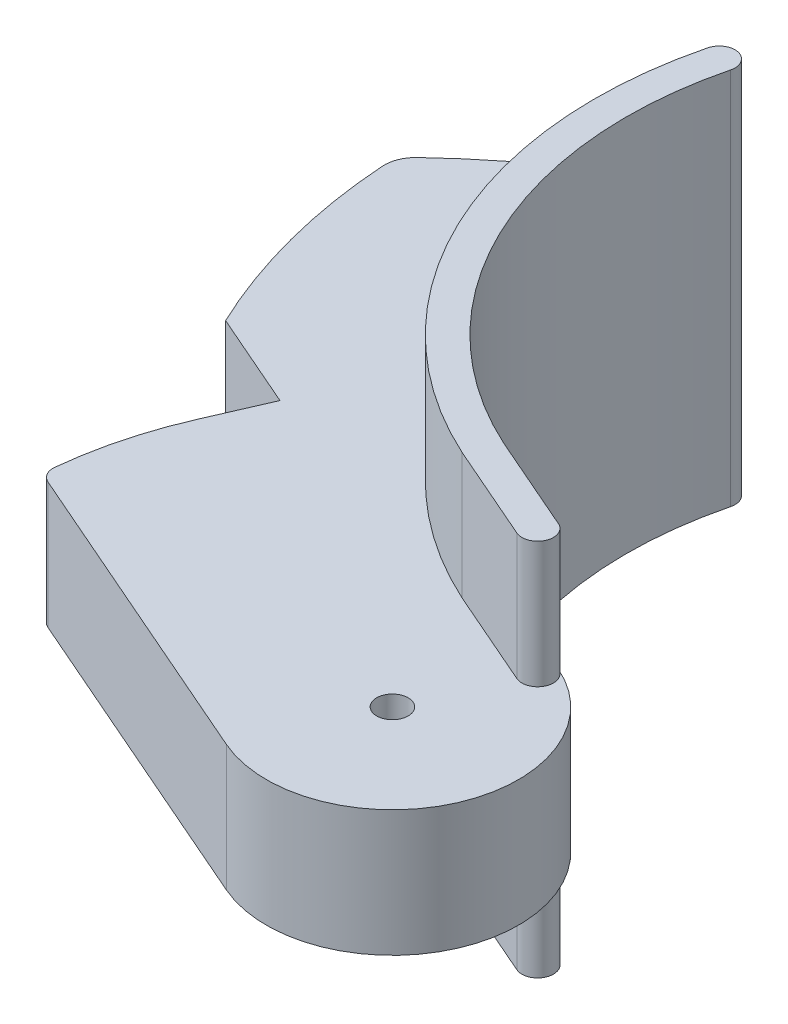
ISO-10303-21;
HEADER;
FILE_DESCRIPTION(('STEP AP214'),'2;1');
FILE_NAME('part.step','',(''),(''),'','','');
FILE_SCHEMA(('AUTOMOTIVE_DESIGN { 1 0 10303 214 1 1 1 1 }'));
ENDSEC;
DATA;
#1=APPLICATION_CONTEXT('core data for automotive mechanical design processes');
#2=APPLICATION_PROTOCOL_DEFINITION('international standard','automotive_design',2000,#1);
#3=PRODUCT_CONTEXT('',#1,'mechanical');
#4=PRODUCT('Part','Part','',(#3));
#5=PRODUCT_RELATED_PRODUCT_CATEGORY('part','',(#4));
#6=PRODUCT_DEFINITION_FORMATION('','',#4);
#7=PRODUCT_DEFINITION_CONTEXT('part definition',#1,'design');
#8=PRODUCT_DEFINITION('design','',#6,#7);
#9=PRODUCT_DEFINITION_SHAPE('','',#8);
#10=(LENGTH_UNIT() NAMED_UNIT(*) SI_UNIT(.MILLI.,.METRE.));
#11=(NAMED_UNIT(*) PLANE_ANGLE_UNIT() SI_UNIT($,.RADIAN.));
#12=(NAMED_UNIT(*) SI_UNIT($,.STERADIAN.) SOLID_ANGLE_UNIT());
#13=UNCERTAINTY_MEASURE_WITH_UNIT(LENGTH_MEASURE(1.E-05),#10,'distance_accuracy_value','');
#14=(GEOMETRIC_REPRESENTATION_CONTEXT(3) GLOBAL_UNCERTAINTY_ASSIGNED_CONTEXT((#13)) GLOBAL_UNIT_ASSIGNED_CONTEXT((#10,
#11,#12)) REPRESENTATION_CONTEXT('',''));
#15=CARTESIAN_POINT('',(0.,0.,0.));
#16=DIRECTION('',(0.,0.,1.));
#17=DIRECTION('',(1.,0.,0.));
#18=AXIS2_PLACEMENT_3D('',#15,#16,#17);
#19=CARTESIAN_POINT('',(-86.9889953557017,25.4,59.0304715545123));
#20=DIRECTION('',(0.399879396915967,0.,-0.916567765046383));
#21=DIRECTION('',(-0.916567765046384,0.,-0.399879396915967));
#22=AXIS2_PLACEMENT_3D('',#19,#20,#21);
#23=PLANE('',#22);
#24=DIRECTION('',(0.916567765046383,0.,0.399879396915967));
#25=VECTOR('',#24,1.);
#26=CARTESIAN_POINT('',(-86.9889953557017,0.,59.0304715545123));
#27=LINE('',#26,#25);
#28=CARTESIAN_POINT('',(-106.42279453446,0.,50.551910348517));
#29=VERTEX_POINT('',#28);
#30=CARTESIAN_POINT('',(-86.9889953557017,0.,59.0304715545123));
#31=VERTEX_POINT('',#30);
#32=EDGE_CURVE('E239',#29,#31,#27,.T.);
#33=ORIENTED_EDGE('',*,*,#32,.T.);
#34=DIRECTION('',(0.,-1.,0.));
#35=VECTOR('',#34,1.);
#36=CARTESIAN_POINT('',(-86.9889953557017,25.4,59.0304715545123));
#37=LINE('',#36,#35);
#38=CARTESIAN_POINT('',(-86.9889953557017,25.4,59.0304715545123));
#39=VERTEX_POINT('',#38);
#40=EDGE_CURVE('E304',#39,#31,#37,.T.);
#41=ORIENTED_EDGE('',*,*,#40,.F.);
#42=DIRECTION('',(0.916567765046383,0.,0.399879396915967));
#43=VECTOR('',#42,1.);
#44=CARTESIAN_POINT('',(-86.9889953557017,25.4,59.0304715545123));
#45=LINE('',#44,#43);
#46=CARTESIAN_POINT('',(-106.42279453446,25.4,50.551910348517));
#47=VERTEX_POINT('',#46);
#48=EDGE_CURVE('E243',#47,#39,#45,.T.);
#49=ORIENTED_EDGE('',*,*,#48,.F.);
#50=DIRECTION('',(0.,-1.,0.));
#51=VECTOR('',#50,1.);
#52=CARTESIAN_POINT('',(-106.42279453446,25.4,50.551910348517));
#53=LINE('',#52,#51);
#54=EDGE_CURVE('E307',#47,#29,#53,.T.);
#55=ORIENTED_EDGE('',*,*,#54,.T.);
#56=EDGE_LOOP('',(#33,#41,#49,#55));
#57=FACE_BOUND('',#56,.T.);
#58=ADVANCED_FACE('F37',(#57),#23,.F.);
#59=CARTESIAN_POINT('',(-92.0674636965345,25.4,70.6708821706013));
#60=DIRECTION('',(0.916567765046384,0.,0.399879396915965));
#61=DIRECTION('',(0.399879396915966,0.,-0.916567765046384));
#62=AXIS2_PLACEMENT_3D('',#59,#60,#61);
#63=PLANE('',#62);
#64=DIRECTION('',(-0.399879396915966,0.,0.916567765046384));
#65=VECTOR('',#64,1.);
#66=CARTESIAN_POINT('',(-92.0674636965345,0.,70.6708821706013));
#67=LINE('',#66,#65);
#68=CARTESIAN_POINT('',(-92.0674636965345,0.,70.6708821706013));
#69=VERTEX_POINT('',#68);
#70=EDGE_CURVE('E263',#31,#69,#67,.T.);
#71=ORIENTED_EDGE('',*,*,#70,.T.);
#72=DIRECTION('',(0.,-1.,0.));
#73=VECTOR('',#72,1.);
#74=CARTESIAN_POINT('',(-92.0674636965345,25.4,70.6708821706013));
#75=LINE('',#74,#73);
#76=CARTESIAN_POINT('',(-92.0674636965345,25.4,70.6708821706013));
#77=VERTEX_POINT('',#76);
#78=EDGE_CURVE('E301',#77,#69,#75,.T.);
#79=ORIENTED_EDGE('',*,*,#78,.F.);
#80=DIRECTION('',(-0.399879396915966,0.,0.916567765046384));
#81=VECTOR('',#80,1.);
#82=CARTESIAN_POINT('',(-92.0674636965345,25.4,70.6708821706013));
#83=LINE('',#82,#81);
#84=EDGE_CURVE('E246',#39,#77,#83,.T.);
#85=ORIENTED_EDGE('',*,*,#84,.F.);
#86=ORIENTED_EDGE('',*,*,#40,.T.);
#87=EDGE_LOOP('',(#71,#79,#85,#86));
#88=FACE_BOUND('',#87,.T.);
#89=ADVANCED_FACE('F358',(#88),#63,.F.);
#90=CARTESIAN_POINT('',(-22.225,25.4,101.141692215598));
#91=DIRECTION('',(0.,-1.,0.));
#92=DIRECTION('',(0.,0.,-1.));
#93=AXIS2_PLACEMENT_3D('',#90,#91,#92);
#94=CYLINDRICAL_SURFACE('',#93,76.2);
#95=CARTESIAN_POINT('',(-22.225,0.,101.141692215598));
#96=DIRECTION('',(0.,1.,0.));
#97=DIRECTION('',(0.,0.,1.));
#98=AXIS2_PLACEMENT_3D('',#95,#96,#97);
#99=CIRCLE('',#98,76.2);
#100=CARTESIAN_POINT('',(-98.0279297325252,0.,93.3727898500221));
#101=VERTEX_POINT('',#100);
#102=EDGE_CURVE('E265',#69,#101,#99,.T.);
#103=ORIENTED_EDGE('',*,*,#102,.T.);
#104=DIRECTION('',(0.,-1.,0.));
#105=VECTOR('',#104,1.);
#106=CARTESIAN_POINT('',(-98.0279297325252,25.4,93.3727898500221));
#107=LINE('',#106,#105);
#108=CARTESIAN_POINT('',(-98.0279297325252,25.4,93.3727898500221));
#109=VERTEX_POINT('',#108);
#110=EDGE_CURVE('E298',#109,#101,#107,.T.);
#111=ORIENTED_EDGE('',*,*,#110,.F.);
#112=CARTESIAN_POINT('',(-22.225,25.4,101.141692215598));
#113=DIRECTION('',(0.,1.,0.));
#114=DIRECTION('',(0.,0.,1.));
#115=AXIS2_PLACEMENT_3D('',#112,#113,#114);
#116=CIRCLE('',#115,76.2);
#117=EDGE_CURVE('E248',#77,#109,#116,.T.);
#118=ORIENTED_EDGE('',*,*,#117,.F.);
#119=ORIENTED_EDGE('',*,*,#78,.T.);
#120=EDGE_LOOP('',(#103,#111,#118,#119));
#121=FACE_BOUND('',#120,.T.);
#122=ADVANCED_FACE('F352',(#121),#94,.T.);
#123=CARTESIAN_POINT('',(-94.8694743270033,25.4,93.6964941152544));
#124=DIRECTION('',(0.,-1.,0.));
#125=DIRECTION('',(0.,0.,-1.));
#126=AXIS2_PLACEMENT_3D('',#123,#124,#125);
#127=CYLINDRICAL_SURFACE('',#126,3.17499999999999);
#128=CARTESIAN_POINT('',(-94.8694743270033,0.,93.6964941152544));
#129=DIRECTION('',(0.,1.,0.));
#130=DIRECTION('',(0.,0.,-1.));
#131=AXIS2_PLACEMENT_3D('',#128,#129,#130);
#132=CIRCLE('',#131,3.17499999999999);
#133=CARTESIAN_POINT('',(-96.1390914122115,0.,96.6065967692766));
#134=VERTEX_POINT('',#133);
#135=EDGE_CURVE('E267',#101,#134,#132,.T.);
#136=ORIENTED_EDGE('',*,*,#135,.T.);
#137=DIRECTION('',(0.,-1.,0.));
#138=VECTOR('',#137,1.);
#139=CARTESIAN_POINT('',(-96.1390914122115,25.4,96.6065967692766));
#140=LINE('',#139,#138);
#141=CARTESIAN_POINT('',(-96.1390914122115,25.4,96.6065967692766));
#142=VERTEX_POINT('',#141);
#143=EDGE_CURVE('E295',#142,#134,#140,.T.);
#144=ORIENTED_EDGE('',*,*,#143,.F.);
#145=CARTESIAN_POINT('',(-94.8694743270033,25.4,93.6964941152544));
#146=DIRECTION('',(0.,1.,0.));
#147=DIRECTION('',(0.,0.,-1.));
#148=AXIS2_PLACEMENT_3D('',#145,#146,#147);
#149=CIRCLE('',#148,3.17499999999999);
#150=EDGE_CURVE('E250',#109,#142,#149,.T.);
#151=ORIENTED_EDGE('',*,*,#150,.F.);
#152=ORIENTED_EDGE('',*,*,#110,.T.);
#153=EDGE_LOOP('',(#136,#144,#151,#152));
#154=FACE_BOUND('',#153,.T.);
#155=ADVANCED_FACE('F348',(#154),#127,.T.);
#156=CARTESIAN_POINT('',(-32.3819366816655,25.4,124.422513447776));
#157=DIRECTION('',(0.399879396915966,0.,-0.916567765046384));
#158=DIRECTION('',(-0.916567765046384,0.,-0.399879396915966));
#159=AXIS2_PLACEMENT_3D('',#156,#157,#158);
#160=PLANE('',#159);
#161=DIRECTION('',(0.916567765046384,0.,0.399879396915966));
#162=VECTOR('',#161,1.);
#163=CARTESIAN_POINT('',(-32.3819366816655,0.,124.422513447776));
#164=LINE('',#163,#162);
#165=CARTESIAN_POINT('',(-32.3819366816655,0.,124.422513447776));
#166=VERTEX_POINT('',#165);
#167=EDGE_CURVE('E269',#134,#166,#164,.T.);
#168=ORIENTED_EDGE('',*,*,#167,.T.);
#169=DIRECTION('',(0.,-1.,0.));
#170=VECTOR('',#169,1.);
#171=CARTESIAN_POINT('',(-32.3819366816655,25.4,124.422513447776));
#172=LINE('',#171,#170);
#173=CARTESIAN_POINT('',(-32.3819366816655,25.4,124.422513447776));
#174=VERTEX_POINT('',#173);
#175=EDGE_CURVE('E292',#174,#166,#172,.T.);
#176=ORIENTED_EDGE('',*,*,#175,.F.);
#177=DIRECTION('',(0.916567765046384,0.,0.399879396915966));
#178=VECTOR('',#177,1.);
#179=CARTESIAN_POINT('',(-32.3819366816655,25.4,124.422513447776));
#180=LINE('',#179,#178);
#181=EDGE_CURVE('E252',#142,#174,#180,.T.);
#182=ORIENTED_EDGE('',*,*,#181,.F.);
#183=ORIENTED_EDGE('',*,*,#143,.T.);
#184=EDGE_LOOP('',(#168,#176,#182,#183));
#185=FACE_BOUND('',#184,.T.);
#186=ADVANCED_FACE('F343',(#185),#160,.F.);
#187=CARTESIAN_POINT('',(-22.225,25.4,101.141692215598));
#188=DIRECTION('',(0.,-1.,0.));
#189=DIRECTION('',(0.,0.,-1.));
#190=AXIS2_PLACEMENT_3D('',#187,#188,#189);
#191=CYLINDRICAL_SURFACE('',#190,25.4);
#192=CARTESIAN_POINT('',(-22.225,0.,101.141692215598));
#193=DIRECTION('',(0.,1.,0.));
#194=DIRECTION('',(0.,0.,-1.));
#195=AXIS2_PLACEMENT_3D('',#192,#193,#194);
#196=CIRCLE('',#195,25.4);
#197=CARTESIAN_POINT('',(-12.0680633183345,0.,77.8608709834198));
#198=VERTEX_POINT('',#197);
#199=EDGE_CURVE('E271',#166,#198,#196,.T.);
#200=ORIENTED_EDGE('',*,*,#199,.T.);
#201=DIRECTION('',(0.,-1.,0.));
#202=VECTOR('',#201,1.);
#203=CARTESIAN_POINT('',(-12.0680633183345,25.4,77.8608709834198));
#204=LINE('',#203,#202);
#205=CARTESIAN_POINT('',(-12.0680633183345,25.4,77.8608709834198));
#206=VERTEX_POINT('',#205);
#207=EDGE_CURVE('E290',#206,#198,#204,.T.);
#208=ORIENTED_EDGE('',*,*,#207,.F.);
#209=CARTESIAN_POINT('',(-22.225,25.4,101.141692215598));
#210=DIRECTION('',(0.,1.,0.));
#211=DIRECTION('',(0.,0.,-1.));
#212=AXIS2_PLACEMENT_3D('',#209,#210,#211);
#213=CIRCLE('',#212,25.4);
#214=EDGE_CURVE('E254',#174,#206,#213,.T.);
#215=ORIENTED_EDGE('',*,*,#214,.F.);
#216=ORIENTED_EDGE('',*,*,#175,.T.);
#217=EDGE_LOOP('',(#200,#208,#215,#216));
#218=FACE_BOUND('',#217,.T.);
#219=ADVANCED_FACE('F337',(#218),#191,.T.);
#220=CARTESIAN_POINT('',(-12.0680633183345,25.4,77.8608709834198));
#221=DIRECTION('',(-0.399879396915966,0.,0.916567765046384));
#222=DIRECTION('',(0.916567765046384,0.,0.399879396915966));
#223=AXIS2_PLACEMENT_3D('',#220,#221,#222);
#224=PLANE('',#223);
#225=ORIENTED_EDGE('',*,*,#207,.T.);
#226=DIRECTION('',(0.,1.,0.));
#227=VECTOR('',#226,1.);
#228=CARTESIAN_POINT('',(-12.0680633183345,-25.4,77.8608709834198));
#229=LINE('',#228,#227);
#230=CARTESIAN_POINT('',(-12.0680633183345,-25.4,77.8608709834198));
#231=VERTEX_POINT('',#230);
#232=EDGE_CURVE('E174',#231,#198,#229,.T.);
#233=ORIENTED_EDGE('',*,*,#232,.F.);
#234=DIRECTION('',(-0.916567765046384,0.,-0.399879396915965));
#235=VECTOR('',#234,1.);
#236=CARTESIAN_POINT('',(-12.0680633183345,-25.4,77.8608709834198));
#237=LINE('',#236,#235);
#238=CARTESIAN_POINT('',(-31.5678492899854,-25.4,69.3535211161248));
#239=VERTEX_POINT('',#238);
#240=EDGE_CURVE('E207',#231,#239,#237,.T.);
#241=ORIENTED_EDGE('',*,*,#240,.T.);
#242=DIRECTION('',(0.,-1.,0.));
#243=VECTOR('',#242,1.);
#244=CARTESIAN_POINT('',(-31.5678492899854,25.4,69.3535211161248));
#245=LINE('',#244,#243);
#246=CARTESIAN_POINT('',(-31.5678492899854,50.8,69.3535211161248));
#247=VERTEX_POINT('',#246);
#248=EDGE_CURVE('E181',#247,#239,#245,.T.);
#249=ORIENTED_EDGE('',*,*,#248,.F.);
#250=DIRECTION('',(-0.916567765046384,0.,-0.399879396915965));
#251=VECTOR('',#250,1.);
#252=CARTESIAN_POINT('',(-12.0680633183345,50.8,77.8608709834198));
#253=LINE('',#252,#251);
#254=CARTESIAN_POINT('',(-12.0680633183345,50.8,77.8608709834198));
#255=VERTEX_POINT('',#254);
#256=EDGE_CURVE('E178',#255,#247,#253,.T.);
#257=ORIENTED_EDGE('',*,*,#256,.F.);
#258=EDGE_CURVE('E166',#206,#255,#229,.T.);
#259=ORIENTED_EDGE('',*,*,#258,.F.);
#260=EDGE_LOOP('',(#225,#233,#241,#249,#257,#259));
#261=FACE_BOUND('',#260,.T.);
#262=ADVANCED_FACE('F179',(#261),#224,.F.);
#263=CARTESIAN_POINT('',(0.,25.4,0.));
#264=DIRECTION('',(0.,-1.,0.));
#265=DIRECTION('',(0.,0.,-1.));
#266=AXIS2_PLACEMENT_3D('',#263,#264,#265);
#267=CYLINDRICAL_SURFACE('',#266,76.2);
#268=ORIENTED_EDGE('',*,*,#248,.T.);
#269=CARTESIAN_POINT('',(0.,-25.4,0.));
#270=DIRECTION('',(0.,-1.,0.));
#271=DIRECTION('',(0.,0.,1.));
#272=AXIS2_PLACEMENT_3D('',#269,#270,#271);
#273=CIRCLE('',#272,76.2);
#274=CARTESIAN_POINT('',(-73.8821424870336,-25.4,-18.6512471841873));
#275=VERTEX_POINT('',#274);
#276=EDGE_CURVE('E209',#239,#275,#273,.T.);
#277=ORIENTED_EDGE('',*,*,#276,.T.);
#278=DIRECTION('',(0.,-1.,0.));
#279=VECTOR('',#278,1.);
#280=CARTESIAN_POINT('',(-73.8821424870336,25.4,-18.6512471841873));
#281=LINE('',#280,#279);
#282=CARTESIAN_POINT('',(-73.8821424870336,50.8,-18.6512471841873));
#283=VERTEX_POINT('',#282);
#284=EDGE_CURVE('E287',#283,#275,#281,.T.);
#285=ORIENTED_EDGE('',*,*,#284,.F.);
#286=CARTESIAN_POINT('',(0.,50.8,0.));
#287=DIRECTION('',(0.,-1.,0.));
#288=DIRECTION('',(0.,0.,1.));
#289=AXIS2_PLACEMENT_3D('',#286,#287,#288);
#290=CIRCLE('',#289,76.2);
#291=EDGE_CURVE('E185',#247,#283,#290,.T.);
#292=ORIENTED_EDGE('',*,*,#291,.F.);
#293=EDGE_LOOP('',(#268,#277,#285,#292));
#294=FACE_BOUND('',#293,.T.);
#295=ADVANCED_FACE('F381',(#294),#267,.F.);
#296=CARTESIAN_POINT('',(-76.9605650906601,25.4,-19.4283824835284));
#297=DIRECTION('',(0.,-1.,0.));
#298=DIRECTION('',(0.,0.,-1.));
#299=AXIS2_PLACEMENT_3D('',#296,#297,#298);
#300=CYLINDRICAL_SURFACE('',#299,3.17500000000003);
#301=ORIENTED_EDGE('',*,*,#284,.T.);
#302=CARTESIAN_POINT('',(-76.9605650906601,-25.4,-19.4283824835284));
#303=DIRECTION('',(0.,1.,0.));
#304=DIRECTION('',(0.,0.,1.));
#305=AXIS2_PLACEMENT_3D('',#302,#303,#304);
#306=CIRCLE('',#305,3.175);
#307=CARTESIAN_POINT('',(-80.0389876942865,-25.4,-20.2055177828696));
#308=VERTEX_POINT('',#307);
#309=EDGE_CURVE('E212',#275,#308,#306,.T.);
#310=ORIENTED_EDGE('',*,*,#309,.T.);
#311=DIRECTION('',(0.,1.,0.));
#312=VECTOR('',#311,1.);
#313=CARTESIAN_POINT('',(-80.0389876942865,-25.4,-20.2055177828696));
#314=LINE('',#313,#312);
#315=CARTESIAN_POINT('',(-80.0389876942865,0.,-20.2055177828696));
#316=VERTEX_POINT('',#315);
#317=EDGE_CURVE('E229',#308,#316,#314,.T.);
#318=ORIENTED_EDGE('',*,*,#317,.T.);
#319=CARTESIAN_POINT('',(-76.9605650906601,0.,-19.4283824835284));
#320=DIRECTION('',(0.,1.,0.));
#321=DIRECTION('',(0.,0.,1.));
#322=AXIS2_PLACEMENT_3D('',#319,#320,#321);
#323=CIRCLE('',#322,3.175);
#324=CARTESIAN_POINT('',(-78.2730178225984,0.,-22.3194191187906));
#325=VERTEX_POINT('',#324);
#326=EDGE_CURVE('E310',#325,#316,#323,.T.);
#327=ORIENTED_EDGE('',*,*,#326,.F.);
#328=DIRECTION('',(0.,-1.,0.));
#329=VECTOR('',#328,1.);
#330=CARTESIAN_POINT('',(-78.2730178225984,25.4,-22.3194191187906));
#331=LINE('',#330,#329);
#332=CARTESIAN_POINT('',(-78.2730178225984,25.4,-22.3194191187906));
#333=VERTEX_POINT('',#332);
#334=EDGE_CURVE('E284',#333,#325,#331,.T.);
#335=ORIENTED_EDGE('',*,*,#334,.F.);
#336=CARTESIAN_POINT('',(-76.9605650906601,25.4,-19.4283824835284));
#337=DIRECTION('',(0.,1.,0.));
#338=DIRECTION('',(0.,0.,1.));
#339=AXIS2_PLACEMENT_3D('',#336,#337,#338);
#340=CIRCLE('',#339,3.175);
#341=CARTESIAN_POINT('',(-80.0389876942865,25.4,-20.2055177828696));
#342=VERTEX_POINT('',#341);
#343=EDGE_CURVE('E223',#333,#342,#340,.T.);
#344=ORIENTED_EDGE('',*,*,#343,.T.);
#345=CARTESIAN_POINT('',(-80.0389876942865,50.8,-20.2055177828696));
#346=VERTEX_POINT('',#345);
#347=EDGE_CURVE('E231',#342,#346,#314,.T.);
#348=ORIENTED_EDGE('',*,*,#347,.T.);
#349=CARTESIAN_POINT('',(-76.9605650906601,50.8,-19.4283824835284));
#350=DIRECTION('',(0.,1.,0.));
#351=DIRECTION('',(0.,0.,1.));
#352=AXIS2_PLACEMENT_3D('',#349,#350,#351);
#353=CIRCLE('',#352,3.175);
#354=EDGE_CURVE('E198',#283,#346,#353,.T.);
#355=ORIENTED_EDGE('',*,*,#354,.F.);
#356=EDGE_LOOP('',(#301,#310,#318,#327,#335,#344,#348,#355));
#357=FACE_BOUND('',#356,.T.);
#358=ADVANCED_FACE('F377',(#357),#300,.T.);
#359=CARTESIAN_POINT('',(-22.225,25.4,101.141692215598));
#360=DIRECTION('',(0.,-1.,0.));
#361=DIRECTION('',(0.,0.,-1.));
#362=AXIS2_PLACEMENT_3D('',#359,#360,#361);
#363=CYLINDRICAL_SURFACE('',#362,135.587707089413);
#364=CARTESIAN_POINT('',(-22.225,0.,101.141692215598));
#365=DIRECTION('',(0.,1.,0.));
#366=DIRECTION('',(0.,0.,-1.));
#367=AXIS2_PLACEMENT_3D('',#364,#365,#366);
#368=CIRCLE('',#367,135.587707089413);
#369=CARTESIAN_POINT('',(-115.593885953637,0.,2.82446356496252));
#370=VERTEX_POINT('',#369);
#371=EDGE_CURVE('E274',#325,#370,#368,.T.);
#372=ORIENTED_EDGE('',*,*,#371,.T.);
#373=DIRECTION('',(0.,-1.,0.));
#374=VECTOR('',#373,1.);
#375=CARTESIAN_POINT('',(-115.593885953637,25.4,2.82446356496252));
#376=LINE('',#375,#374);
#377=CARTESIAN_POINT('',(-115.593885953637,25.4,2.82446356496252));
#378=VERTEX_POINT('',#377);
#379=EDGE_CURVE('E281',#378,#370,#376,.T.);
#380=ORIENTED_EDGE('',*,*,#379,.F.);
#381=CARTESIAN_POINT('',(-22.225,25.4,101.141692215598));
#382=DIRECTION('',(0.,1.,0.));
#383=DIRECTION('',(0.,0.,-1.));
#384=AXIS2_PLACEMENT_3D('',#381,#382,#383);
#385=CIRCLE('',#384,135.587707089413);
#386=EDGE_CURVE('E256',#333,#378,#385,.T.);
#387=ORIENTED_EDGE('',*,*,#386,.F.);
#388=ORIENTED_EDGE('',*,*,#334,.T.);
#389=EDGE_LOOP('',(#372,#380,#387,#388));
#390=FACE_BOUND('',#389,.T.);
#391=ADVANCED_FACE('F374',(#390),#363,.T.);
#392=CARTESIAN_POINT('',(-111.221126515979,25.4,7.42896949941149));
#393=DIRECTION('',(0.,-1.,0.));
#394=DIRECTION('',(0.,0.,-1.));
#395=AXIS2_PLACEMENT_3D('',#392,#393,#394);
#396=CYLINDRICAL_SURFACE('',#395,6.34999999999998);
#397=CARTESIAN_POINT('',(-111.221126515979,0.,7.42896949941149));
#398=DIRECTION('',(0.,1.,0.));
#399=DIRECTION('',(0.,0.,1.));
#400=AXIS2_PLACEMENT_3D('',#397,#398,#399);
#401=CIRCLE('',#400,6.34999999999998);
#402=CARTESIAN_POINT('',(-117.557008422437,0.,7.8521721310463));
#403=VERTEX_POINT('',#402);
#404=EDGE_CURVE('E276',#370,#403,#401,.T.);
#405=ORIENTED_EDGE('',*,*,#404,.T.);
#406=DIRECTION('',(0.,-1.,0.));
#407=VECTOR('',#406,1.);
#408=CARTESIAN_POINT('',(-117.557008422437,25.4,7.8521721310463));
#409=LINE('',#408,#407);
#410=CARTESIAN_POINT('',(-117.557008422437,25.4,7.8521721310463));
#411=VERTEX_POINT('',#410);
#412=EDGE_CURVE('E261',#411,#403,#409,.T.);
#413=ORIENTED_EDGE('',*,*,#412,.F.);
#414=CARTESIAN_POINT('',(-111.221126515979,25.4,7.42896949941149));
#415=DIRECTION('',(0.,1.,0.));
#416=DIRECTION('',(0.,0.,1.));
#417=AXIS2_PLACEMENT_3D('',#414,#415,#416);
#418=CIRCLE('',#417,6.34999999999998);
#419=EDGE_CURVE('E258',#378,#411,#418,.T.);
#420=ORIENTED_EDGE('',*,*,#419,.F.);
#421=ORIENTED_EDGE('',*,*,#379,.T.);
#422=EDGE_LOOP('',(#405,#413,#420,#421));
#423=FACE_BOUND('',#422,.T.);
#424=ADVANCED_FACE('F369',(#423),#396,.T.);
#425=CARTESIAN_POINT('',(0.,25.4,0.));
#426=DIRECTION('',(0.,-1.,0.));
#427=DIRECTION('',(0.,0.,-1.));
#428=AXIS2_PLACEMENT_3D('',#425,#426,#427);
#429=CYLINDRICAL_SURFACE('',#428,117.818957882034);
#430=CARTESIAN_POINT('',(0.,0.,0.));
#431=DIRECTION('',(0.,1.,0.));
#432=DIRECTION('',(0.,0.,-1.));
#433=AXIS2_PLACEMENT_3D('',#430,#431,#432);
#434=CIRCLE('',#433,117.818957882034);
#435=EDGE_CURVE('E244',#403,#29,#434,.T.);
#436=ORIENTED_EDGE('',*,*,#435,.T.);
#437=ORIENTED_EDGE('',*,*,#54,.F.);
#438=CARTESIAN_POINT('',(0.,25.4,0.));
#439=DIRECTION('',(0.,1.,0.));
#440=DIRECTION('',(0.,0.,1.));
#441=AXIS2_PLACEMENT_3D('',#438,#439,#440);
#442=CIRCLE('',#441,117.818957882034);
#443=EDGE_CURVE('E240',#411,#47,#442,.T.);
#444=ORIENTED_EDGE('',*,*,#443,.F.);
#445=ORIENTED_EDGE('',*,*,#412,.T.);
#446=EDGE_LOOP('',(#436,#437,#444,#445));
#447=FACE_BOUND('',#446,.T.);
#448=ADVANCED_FACE('F364',(#447),#429,.T.);
#449=CARTESIAN_POINT('',(0.,25.4,0.));
#450=DIRECTION('',(0.,1.,0.));
#451=DIRECTION('',(0.,0.,1.));
#452=AXIS2_PLACEMENT_3D('',#449,#450,#451);
#453=PLANE('',#452);
#454=CARTESIAN_POINT('',(-22.225,25.4,101.141692215598));
#455=DIRECTION('',(0.,1.,0.));
#456=DIRECTION('',(0.,0.,1.));
#457=AXIS2_PLACEMENT_3D('',#454,#455,#456);
#458=CIRCLE('',#457,3.175);
#459=CARTESIAN_POINT('',(-22.225,25.4,104.316692215598));
#460=VERTEX_POINT('',#459);
#461=EDGE_CURVE('E194',#460,#460,#458,.T.);
#462=ORIENTED_EDGE('',*,*,#461,.F.);
#463=EDGE_LOOP('',(#462));
#464=FACE_BOUND('',#463,.T.);
#465=CARTESIAN_POINT('',(-13.3376804035427,25.4,80.770973637442));
#466=DIRECTION('',(0.,1.,0.));
#467=DIRECTION('',(0.,0.,1.));
#468=AXIS2_PLACEMENT_3D('',#465,#466,#467);
#469=CIRCLE('',#468,3.175);
#470=CARTESIAN_POINT('',(-14.6072974887509,25.4,83.6810762914643));
#471=VERTEX_POINT('',#470);
#472=EDGE_CURVE('E52',#471,#206,#469,.T.);
#473=ORIENTED_EDGE('',*,*,#472,.F.);
#474=DIRECTION('',(0.916567765046384,0.,0.399879396915965));
#475=VECTOR('',#474,1.);
#476=CARTESIAN_POINT('',(-33.0062591104024,25.4,75.6539931256346));
#477=LINE('',#476,#475);
#478=CARTESIAN_POINT('',(-34.1520361580498,25.4,75.1541144998679));
#479=VERTEX_POINT('',#478);
#480=EDGE_CURVE('E56',#479,#471,#477,.T.);
#481=ORIENTED_EDGE('',*,*,#480,.F.);
#482=CARTESIAN_POINT('',(0.,25.4,0.));
#483=DIRECTION('',(0.,1.,0.));
#484=DIRECTION('',(0.,0.,1.));
#485=AXIS2_PLACEMENT_3D('',#482,#483,#484);
#486=CIRCLE('',#485,82.55);
#487=EDGE_CURVE('E235',#342,#479,#486,.T.);
#488=ORIENTED_EDGE('',*,*,#487,.F.);
#489=ORIENTED_EDGE('',*,*,#343,.F.);
#490=ORIENTED_EDGE('',*,*,#386,.T.);
#491=ORIENTED_EDGE('',*,*,#419,.T.);
#492=ORIENTED_EDGE('',*,*,#443,.T.);
#493=ORIENTED_EDGE('',*,*,#48,.T.);
#494=ORIENTED_EDGE('',*,*,#84,.T.);
#495=ORIENTED_EDGE('',*,*,#117,.T.);
#496=ORIENTED_EDGE('',*,*,#150,.T.);
#497=ORIENTED_EDGE('',*,*,#181,.T.);
#498=ORIENTED_EDGE('',*,*,#214,.T.);
#499=EDGE_LOOP('',(#473,#481,#488,#489,#490,#491,#492,#493,#494,#495,#496,#497,#498));
#500=FACE_BOUND('',#499,.T.);
#501=ADVANCED_FACE('F425',(#464,#500),#453,.T.);
#502=CARTESIAN_POINT('',(0.,0.,0.));
#503=DIRECTION('',(0.,1.,0.));
#504=DIRECTION('',(0.,0.,1.));
#505=AXIS2_PLACEMENT_3D('',#502,#503,#504);
#506=PLANE('',#505);
#507=CARTESIAN_POINT('',(-22.225,0.,101.141692215598));
#508=DIRECTION('',(0.,1.,0.));
#509=DIRECTION('',(0.,0.,1.));
#510=AXIS2_PLACEMENT_3D('',#507,#508,#509);
#511=CIRCLE('',#510,3.175);
#512=CARTESIAN_POINT('',(-22.225,0.,104.316692215598));
#513=VERTEX_POINT('',#512);
#514=EDGE_CURVE('E40',#513,#513,#511,.T.);
#515=ORIENTED_EDGE('',*,*,#514,.T.);
#516=EDGE_LOOP('',(#515));
#517=FACE_BOUND('',#516,.T.);
#518=DIRECTION('',(0.916567765046384,0.,0.399879396915965));
#519=VECTOR('',#518,1.);
#520=CARTESIAN_POINT('',(-33.0062591104024,0.,75.6539931256346));
#521=LINE('',#520,#519);
#522=CARTESIAN_POINT('',(-34.1520361580498,0.,75.1541144998679));
#523=VERTEX_POINT('',#522);
#524=CARTESIAN_POINT('',(-14.6072974887509,0.,83.6810762914643));
#525=VERTEX_POINT('',#524);
#526=EDGE_CURVE('E45',#523,#525,#521,.T.);
#527=ORIENTED_EDGE('',*,*,#526,.T.);
#528=CARTESIAN_POINT('',(-13.3376804035427,0.,80.770973637442));
#529=DIRECTION('',(0.,1.,0.));
#530=DIRECTION('',(0.,0.,1.));
#531=AXIS2_PLACEMENT_3D('',#528,#529,#530);
#532=CIRCLE('',#531,3.175);
#533=EDGE_CURVE('E11',#525,#198,#532,.T.);
#534=ORIENTED_EDGE('',*,*,#533,.T.);
#535=ORIENTED_EDGE('',*,*,#199,.F.);
#536=ORIENTED_EDGE('',*,*,#167,.F.);
#537=ORIENTED_EDGE('',*,*,#135,.F.);
#538=ORIENTED_EDGE('',*,*,#102,.F.);
#539=ORIENTED_EDGE('',*,*,#70,.F.);
#540=ORIENTED_EDGE('',*,*,#32,.F.);
#541=ORIENTED_EDGE('',*,*,#435,.F.);
#542=ORIENTED_EDGE('',*,*,#404,.F.);
#543=ORIENTED_EDGE('',*,*,#371,.F.);
#544=ORIENTED_EDGE('',*,*,#326,.T.);
#545=CARTESIAN_POINT('',(0.,0.,0.));
#546=DIRECTION('',(0.,1.,0.));
#547=DIRECTION('',(0.,0.,1.));
#548=AXIS2_PLACEMENT_3D('',#545,#546,#547);
#549=CIRCLE('',#548,82.55);
#550=EDGE_CURVE('E313',#316,#523,#549,.T.);
#551=ORIENTED_EDGE('',*,*,#550,.T.);
#552=EDGE_LOOP('',(#527,#534,#535,#536,#537,#538,#539,#540,#541,#542,#543,#544,#551));
#553=FACE_BOUND('',#552,.T.);
#554=ADVANCED_FACE('F318',(#517,#553),#506,.F.);
#555=CARTESIAN_POINT('',(-13.3376804035427,-25.4,80.770973637442));
#556=DIRECTION('',(0.,-1.,0.));
#557=DIRECTION('',(0.,0.,-1.));
#558=AXIS2_PLACEMENT_3D('',#555,#556,#557);
#559=PLANE('',#558);
#560=CARTESIAN_POINT('',(-13.3376804035427,-25.4,80.770973637442));
#561=DIRECTION('',(0.,1.,0.));
#562=DIRECTION('',(0.,0.,-1.));
#563=AXIS2_PLACEMENT_3D('',#560,#561,#562);
#564=CIRCLE('',#563,3.175);
#565=CARTESIAN_POINT('',(-14.6072974887509,-25.4,83.6810762914643));
#566=VERTEX_POINT('',#565);
#567=EDGE_CURVE('E204',#566,#231,#564,.T.);
#568=ORIENTED_EDGE('',*,*,#567,.F.);
#569=DIRECTION('',(0.916567765046384,0.,0.399879396915965));
#570=VECTOR('',#569,1.);
#571=CARTESIAN_POINT('',(-14.6072974887509,-25.4,83.6810762914643));
#572=LINE('',#571,#570);
#573=CARTESIAN_POINT('',(-34.1520361580498,-25.4,75.1541144998679));
#574=VERTEX_POINT('',#573);
#575=EDGE_CURVE('E175',#574,#566,#572,.T.);
#576=ORIENTED_EDGE('',*,*,#575,.F.);
#577=CARTESIAN_POINT('',(0.,-25.4,0.));
#578=DIRECTION('',(0.,1.,0.));
#579=DIRECTION('',(0.,0.,1.));
#580=AXIS2_PLACEMENT_3D('',#577,#578,#579);
#581=CIRCLE('',#580,82.55);
#582=EDGE_CURVE('E215',#308,#574,#581,.T.);
#583=ORIENTED_EDGE('',*,*,#582,.F.);
#584=ORIENTED_EDGE('',*,*,#309,.F.);
#585=ORIENTED_EDGE('',*,*,#276,.F.);
#586=ORIENTED_EDGE('',*,*,#240,.F.);
#587=EDGE_LOOP('',(#568,#576,#583,#584,#585,#586));
#588=FACE_BOUND('',#587,.T.);
#589=ADVANCED_FACE('F329',(#588),#559,.T.);
#590=CARTESIAN_POINT('',(0.,-25.4,0.));
#591=DIRECTION('',(0.,1.,0.));
#592=DIRECTION('',(0.,0.,1.));
#593=AXIS2_PLACEMENT_3D('',#590,#591,#592);
#594=CYLINDRICAL_SURFACE('',#593,82.55);
#595=ORIENTED_EDGE('',*,*,#550,.F.);
#596=ORIENTED_EDGE('',*,*,#317,.F.);
#597=ORIENTED_EDGE('',*,*,#582,.T.);
#598=DIRECTION('',(0.,1.,0.));
#599=VECTOR('',#598,1.);
#600=CARTESIAN_POINT('',(-34.1520361580498,-25.4,75.1541144998679));
#601=LINE('',#600,#599);
#602=EDGE_CURVE('E225',#574,#523,#601,.T.);
#603=ORIENTED_EDGE('',*,*,#602,.T.);
#604=EDGE_LOOP('',(#595,#596,#597,#603));
#605=FACE_BOUND('',#604,.T.);
#606=ADVANCED_FACE('F323',(#605),#594,.T.);
#607=CARTESIAN_POINT('',(-14.6072974887509,-25.4,83.6810762914643));
#608=DIRECTION('',(-0.399879396915965,0.,0.916567765046384));
#609=DIRECTION('',(0.916567765046384,0.,0.399879396915965));
#610=AXIS2_PLACEMENT_3D('',#607,#608,#609);
#611=PLANE('',#610);
#612=ORIENTED_EDGE('',*,*,#526,.F.);
#613=ORIENTED_EDGE('',*,*,#602,.F.);
#614=ORIENTED_EDGE('',*,*,#575,.T.);
#615=DIRECTION('',(0.,1.,0.));
#616=VECTOR('',#615,1.);
#617=CARTESIAN_POINT('',(-14.6072974887509,-25.4,83.6810762914643));
#618=LINE('',#617,#616);
#619=EDGE_CURVE('E220',#566,#525,#618,.T.);
#620=ORIENTED_EDGE('',*,*,#619,.T.);
#621=EDGE_LOOP('',(#612,#613,#614,#620));
#622=FACE_BOUND('',#621,.T.);
#623=ADVANCED_FACE('F321',(#622),#611,.T.);
#624=CARTESIAN_POINT('',(-13.3376804035427,-25.4,80.770973637442));
#625=DIRECTION('',(0.,1.,0.));
#626=DIRECTION('',(0.,0.,1.));
#627=AXIS2_PLACEMENT_3D('',#624,#625,#626);
#628=CYLINDRICAL_SURFACE('',#627,3.175);
#629=ORIENTED_EDGE('',*,*,#533,.F.);
#630=ORIENTED_EDGE('',*,*,#619,.F.);
#631=ORIENTED_EDGE('',*,*,#567,.T.);
#632=ORIENTED_EDGE('',*,*,#232,.T.);
#633=EDGE_LOOP('',(#629,#630,#631,#632));
#634=FACE_BOUND('',#633,.T.);
#635=ADVANCED_FACE('F333',(#634),#628,.T.);
#636=CARTESIAN_POINT('',(-14.6072974887509,50.8,83.6810762914643));
#637=VERTEX_POINT('',#636);
#638=EDGE_CURVE('E224',#471,#637,#618,.T.);
#639=ORIENTED_EDGE('',*,*,#638,.F.);
#640=ORIENTED_EDGE('',*,*,#472,.T.);
#641=ORIENTED_EDGE('',*,*,#258,.T.);
#642=CARTESIAN_POINT('',(-13.3376804035427,50.8,80.770973637442));
#643=DIRECTION('',(0.,1.,0.));
#644=DIRECTION('',(0.,0.,-1.));
#645=AXIS2_PLACEMENT_3D('',#642,#643,#644);
#646=CIRCLE('',#645,3.175);
#647=EDGE_CURVE('E171',#637,#255,#646,.T.);
#648=ORIENTED_EDGE('',*,*,#647,.F.);
#649=EDGE_LOOP('',(#639,#640,#641,#648));
#650=FACE_BOUND('',#649,.T.);
#651=ADVANCED_FACE('F169',(#650),#628,.T.);
#652=CARTESIAN_POINT('',(-34.1520361580498,50.8,75.1541144998679));
#653=VERTEX_POINT('',#652);
#654=EDGE_CURVE('E228',#479,#653,#601,.T.);
#655=ORIENTED_EDGE('',*,*,#654,.F.);
#656=ORIENTED_EDGE('',*,*,#480,.T.);
#657=ORIENTED_EDGE('',*,*,#638,.T.);
#658=DIRECTION('',(0.916567765046384,0.,0.399879396915965));
#659=VECTOR('',#658,1.);
#660=CARTESIAN_POINT('',(-14.6072974887509,50.8,83.6810762914643));
#661=LINE('',#660,#659);
#662=EDGE_CURVE('E191',#653,#637,#661,.T.);
#663=ORIENTED_EDGE('',*,*,#662,.F.);
#664=EDGE_LOOP('',(#655,#656,#657,#663));
#665=FACE_BOUND('',#664,.T.);
#666=ADVANCED_FACE('F387',(#665),#611,.T.);
#667=ORIENTED_EDGE('',*,*,#347,.F.);
#668=ORIENTED_EDGE('',*,*,#487,.T.);
#669=ORIENTED_EDGE('',*,*,#654,.T.);
#670=CARTESIAN_POINT('',(0.,50.8,0.));
#671=DIRECTION('',(0.,1.,0.));
#672=DIRECTION('',(0.,0.,1.));
#673=AXIS2_PLACEMENT_3D('',#670,#671,#672);
#674=CIRCLE('',#673,82.55);
#675=EDGE_CURVE('E201',#346,#653,#674,.T.);
#676=ORIENTED_EDGE('',*,*,#675,.F.);
#677=EDGE_LOOP('',(#667,#668,#669,#676));
#678=FACE_BOUND('',#677,.T.);
#679=ADVANCED_FACE('F384',(#678),#594,.T.);
#680=CARTESIAN_POINT('',(-13.3376804035427,50.8,80.770973637442));
#681=DIRECTION('',(0.,-1.,0.));
#682=DIRECTION('',(0.,0.,-1.));
#683=AXIS2_PLACEMENT_3D('',#680,#681,#682);
#684=PLANE('',#683);
#685=ORIENTED_EDGE('',*,*,#647,.T.);
#686=ORIENTED_EDGE('',*,*,#256,.T.);
#687=ORIENTED_EDGE('',*,*,#291,.T.);
#688=ORIENTED_EDGE('',*,*,#354,.T.);
#689=ORIENTED_EDGE('',*,*,#675,.T.);
#690=ORIENTED_EDGE('',*,*,#662,.T.);
#691=EDGE_LOOP('',(#685,#686,#687,#688,#689,#690));
#692=FACE_BOUND('',#691,.T.);
#693=ADVANCED_FACE('F188',(#692),#684,.F.);
#694=CARTESIAN_POINT('',(-22.225,-25.4,101.141692215598));
#695=DIRECTION('',(0.,1.,0.));
#696=DIRECTION('',(0.,0.,1.));
#697=AXIS2_PLACEMENT_3D('',#694,#695,#696);
#698=CYLINDRICAL_SURFACE('',#697,3.175);
#699=ORIENTED_EDGE('',*,*,#461,.T.);
#700=EDGE_LOOP('',(#699));
#701=FACE_BOUND('',#700,.T.);
#702=ORIENTED_EDGE('',*,*,#514,.F.);
#703=EDGE_LOOP('',(#702));
#704=FACE_BOUND('',#703,.T.);
#705=ADVANCED_FACE('F436',(#701,#704),#698,.F.);
#706=CLOSED_SHELL('',(#58,#89,#122,#155,#186,#219,#262,#295,#358,#391,#424,#448,#501,#554,#589,
#606,#623,#635,#651,#666,#679,#693,#705));
#707=MANIFOLD_SOLID_BREP('B2',#706);
#708=ADVANCED_BREP_SHAPE_REPRESENTATION('',(#18,#707),#14);
#709=SHAPE_DEFINITION_REPRESENTATION(#9,#708);
ENDSEC;
END-ISO-10303-21;
